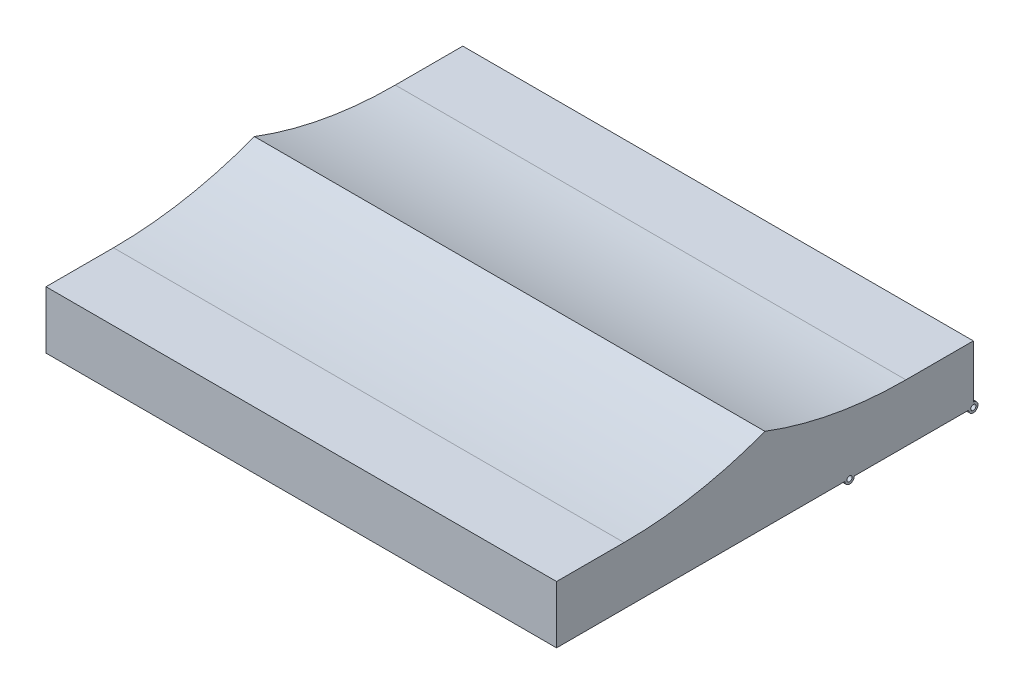
ISO-10303-21;
HEADER;
FILE_DESCRIPTION(('STEP AP214'),'2;1');
FILE_NAME('part.step','',(''),(''),'','','');
FILE_SCHEMA(('AUTOMOTIVE_DESIGN { 1 0 10303 214 1 1 1 1 }'));
ENDSEC;
DATA;
#1=APPLICATION_CONTEXT('core data for automotive mechanical design processes');
#2=APPLICATION_PROTOCOL_DEFINITION('international standard','automotive_design',2000,#1);
#3=PRODUCT_CONTEXT('',#1,'mechanical');
#4=PRODUCT('Part','Part','',(#3));
#5=PRODUCT_RELATED_PRODUCT_CATEGORY('part','',(#4));
#6=PRODUCT_DEFINITION_FORMATION('','',#4);
#7=PRODUCT_DEFINITION_CONTEXT('part definition',#1,'design');
#8=PRODUCT_DEFINITION('design','',#6,#7);
#9=PRODUCT_DEFINITION_SHAPE('','',#8);
#10=(LENGTH_UNIT() NAMED_UNIT(*) SI_UNIT(.MILLI.,.METRE.));
#11=(NAMED_UNIT(*) PLANE_ANGLE_UNIT() SI_UNIT($,.RADIAN.));
#12=(NAMED_UNIT(*) SI_UNIT($,.STERADIAN.) SOLID_ANGLE_UNIT());
#13=UNCERTAINTY_MEASURE_WITH_UNIT(LENGTH_MEASURE(1.E-05),#10,'distance_accuracy_value','');
#14=(GEOMETRIC_REPRESENTATION_CONTEXT(3) GLOBAL_UNCERTAINTY_ASSIGNED_CONTEXT((#13)) GLOBAL_UNIT_ASSIGNED_CONTEXT((#10,
#11,#12)) REPRESENTATION_CONTEXT('',''));
#15=CARTESIAN_POINT('',(0.,0.,0.));
#16=DIRECTION('',(0.,0.,1.));
#17=DIRECTION('',(1.,0.,0.));
#18=AXIS2_PLACEMENT_3D('',#15,#16,#17);
#19=CARTESIAN_POINT('',(245.,-19.3460402114396,-81.23));
#20=DIRECTION('',(1.,0.,0.));
#21=DIRECTION('',(0.,0.,-1.));
#22=AXIS2_PLACEMENT_3D('',#19,#20,#21);
#23=PLANE('',#22);
#24=CARTESIAN_POINT('',(245.,-19.5001634742624,-200.));
#25=DIRECTION('',(1.,0.,0.));
#26=DIRECTION('',(0.,0.,-1.));
#27=AXIS2_PLACEMENT_3D('',#24,#25,#26);
#28=CIRCLE('',#27,2.5);
#29=CARTESIAN_POINT('',(245.,-19.5001634742624,-202.5));
#30=VERTEX_POINT('',#29);
#31=EDGE_CURVE('E170',#30,#30,#28,.T.);
#32=ORIENTED_EDGE('',*,*,#31,.F.);
#33=EDGE_LOOP('',(#32));
#34=FACE_BOUND('',#33,.T.);
#35=DIRECTION('',(0.,0.,-1.));
#36=VECTOR('',#35,1.);
#37=CARTESIAN_POINT('',(245.,-19.3460402114396,200.));
#38=LINE('',#37,#36);
#39=CARTESIAN_POINT('',(245.,-19.3460402114396,200.));
#40=VERTEX_POINT('',#39);
#41=CARTESIAN_POINT('',(245.,-19.3460402114396,-76.73));
#42=VERTEX_POINT('',#41);
#43=EDGE_CURVE('E197',#40,#42,#38,.T.);
#44=ORIENTED_EDGE('',*,*,#43,.T.);
#45=CARTESIAN_POINT('',(245.,-19.3460402114396,-81.23));
#46=DIRECTION('',(1.,0.,0.));
#47=DIRECTION('',(0.,0.,-1.));
#48=AXIS2_PLACEMENT_3D('',#45,#46,#47);
#49=CIRCLE('',#48,4.5);
#50=CARTESIAN_POINT('',(245.,-19.3548194629897,-85.7299914360743));
#51=VERTEX_POINT('',#50);
#52=EDGE_CURVE('E115',#42,#51,#49,.T.);
#53=ORIENTED_EDGE('',*,*,#52,.T.);
#54=DIRECTION('',(0.,-0.00144233146940823,-0.999998959839425));
#55=VECTOR('',#54,1.);
#56=CARTESIAN_POINT('',(245.,-19.3548194629897,-85.7299914360743));
#57=LINE('',#56,#55);
#58=CARTESIAN_POINT('',(245.,-19.5001634742624,-186.500073192128));
#59=VERTEX_POINT('',#58);
#60=EDGE_CURVE('E230',#51,#59,#57,.T.);
#61=ORIENTED_EDGE('',*,*,#60,.T.);
#62=DIRECTION('',(0.,0.,-1.));
#63=VECTOR('',#62,1.);
#64=CARTESIAN_POINT('',(245.,-19.5001634742624,-186.500073192128));
#65=LINE('',#64,#63);
#66=CARTESIAN_POINT('',(245.,-19.5001634742624,-195.524048894466));
#67=VERTEX_POINT('',#66);
#68=EDGE_CURVE('E250',#59,#67,#65,.T.);
#69=ORIENTED_EDGE('',*,*,#68,.T.);
#70=CARTESIAN_POINT('',(245.,-19.5001634742624,-200.));
#71=DIRECTION('',(1.,0.,0.));
#72=DIRECTION('',(0.,0.,-1.));
#73=AXIS2_PLACEMENT_3D('',#70,#71,#72);
#74=CIRCLE('',#73,4.47595110553423);
#75=CARTESIAN_POINT('',(245.,-15.0242123687281,-200.));
#76=VERTEX_POINT('',#75);
#77=EDGE_CURVE('E246',#67,#76,#74,.T.);
#78=ORIENTED_EDGE('',*,*,#77,.T.);
#79=DIRECTION('',(0.,1.,0.));
#80=VECTOR('',#79,1.);
#81=CARTESIAN_POINT('',(245.,-15.0242123687281,-200.));
#82=LINE('',#81,#80);
#83=CARTESIAN_POINT('',(245.,35.8357876312719,-200.));
#84=VERTEX_POINT('',#83);
#85=EDGE_CURVE('E249',#76,#84,#82,.T.);
#86=ORIENTED_EDGE('',*,*,#85,.T.);
#87=DIRECTION('',(0.,0.,1.));
#88=VECTOR('',#87,1.);
#89=CARTESIAN_POINT('',(245.,35.8357876312719,-200.));
#90=LINE('',#89,#88);
#91=CARTESIAN_POINT('',(245.,35.8357876312718,-135.24));
#92=VERTEX_POINT('',#91);
#93=EDGE_CURVE('E254',#84,#92,#90,.T.);
#94=ORIENTED_EDGE('',*,*,#93,.T.);
#95=CARTESIAN_POINT('',(245.,416.55239053099,-135.24));
#96=DIRECTION('',(-1.,0.,0.));
#97=DIRECTION('',(0.,0.,1.));
#98=AXIS2_PLACEMENT_3D('',#95,#96,#97);
#99=CIRCLE('',#98,380.716602899719);
#100=CARTESIAN_POINT('',(245.,60.6657876312717,1.66533453693773E-13));
#101=VERTEX_POINT('',#100);
#102=EDGE_CURVE('E143',#92,#101,#99,.T.);
#103=ORIENTED_EDGE('',*,*,#102,.T.);
#104=CARTESIAN_POINT('',(245.,416.55239053099,135.24));
#105=DIRECTION('',(-1.,0.,0.));
#106=DIRECTION('',(0.,0.,-1.));
#107=AXIS2_PLACEMENT_3D('',#104,#105,#106);
#108=CIRCLE('',#107,380.716602899719);
#109=CARTESIAN_POINT('',(245.,35.8357876312719,135.24));
#110=VERTEX_POINT('',#109);
#111=EDGE_CURVE('E137',#101,#110,#108,.T.);
#112=ORIENTED_EDGE('',*,*,#111,.T.);
#113=DIRECTION('',(0.,0.,1.));
#114=VECTOR('',#113,1.);
#115=CARTESIAN_POINT('',(245.,35.8357876312719,200.));
#116=LINE('',#115,#114);
#117=CARTESIAN_POINT('',(245.,35.8357876312719,200.));
#118=VERTEX_POINT('',#117);
#119=EDGE_CURVE('E141',#110,#118,#116,.T.);
#120=ORIENTED_EDGE('',*,*,#119,.T.);
#121=DIRECTION('',(0.,-1.,0.));
#122=VECTOR('',#121,1.);
#123=CARTESIAN_POINT('',(245.,-19.3460402114396,200.));
#124=LINE('',#123,#122);
#125=EDGE_CURVE('E63',#118,#40,#124,.T.);
#126=ORIENTED_EDGE('',*,*,#125,.T.);
#127=EDGE_LOOP('',(#44,#53,#61,#69,#78,#86,#94,#103,#112,#120,#126));
#128=FACE_BOUND('',#127,.T.);
#129=CARTESIAN_POINT('',(245.,-19.3460402114396,-81.23));
#130=DIRECTION('',(1.,0.,0.));
#131=DIRECTION('',(0.,0.,-1.));
#132=AXIS2_PLACEMENT_3D('',#129,#130,#131);
#133=CIRCLE('',#132,2.50000000000001);
#134=CARTESIAN_POINT('',(245.,-19.3460402114396,-83.73));
#135=VERTEX_POINT('',#134);
#136=EDGE_CURVE('E301',#135,#135,#133,.T.);
#137=ORIENTED_EDGE('',*,*,#136,.F.);
#138=EDGE_LOOP('',(#137));
#139=FACE_BOUND('',#138,.T.);
#140=ADVANCED_FACE('F45',(#34,#128,#139),#23,.T.);
#141=CARTESIAN_POINT('',(-245.,-19.3460402114396,-81.23));
#142=DIRECTION('',(1.,0.,0.));
#143=DIRECTION('',(0.,0.,-1.));
#144=AXIS2_PLACEMENT_3D('',#141,#142,#143);
#145=PLANE('',#144);
#146=DIRECTION('',(0.,0.,-1.));
#147=VECTOR('',#146,1.);
#148=CARTESIAN_POINT('',(-245.,-19.3460402114396,200.));
#149=LINE('',#148,#147);
#150=CARTESIAN_POINT('',(-245.,-19.3460402114396,200.));
#151=VERTEX_POINT('',#150);
#152=CARTESIAN_POINT('',(-245.,-19.3460402114396,-76.73));
#153=VERTEX_POINT('',#152);
#154=EDGE_CURVE('E165',#151,#153,#149,.T.);
#155=ORIENTED_EDGE('',*,*,#154,.F.);
#156=DIRECTION('',(0.,-1.,0.));
#157=VECTOR('',#156,1.);
#158=CARTESIAN_POINT('',(-245.,-19.3460402114396,200.));
#159=LINE('',#158,#157);
#160=CARTESIAN_POINT('',(-245.,35.8357876312719,200.));
#161=VERTEX_POINT('',#160);
#162=EDGE_CURVE('E107',#161,#151,#159,.T.);
#163=ORIENTED_EDGE('',*,*,#162,.F.);
#164=DIRECTION('',(0.,0.,1.));
#165=VECTOR('',#164,1.);
#166=CARTESIAN_POINT('',(-245.,35.8357876312719,200.));
#167=LINE('',#166,#165);
#168=CARTESIAN_POINT('',(-245.,35.8357876312719,135.24));
#169=VERTEX_POINT('',#168);
#170=EDGE_CURVE('E101',#169,#161,#167,.T.);
#171=ORIENTED_EDGE('',*,*,#170,.F.);
#172=CARTESIAN_POINT('',(-245.,416.55239053099,135.24));
#173=DIRECTION('',(-1.,0.,0.));
#174=DIRECTION('',(0.,0.,-1.));
#175=AXIS2_PLACEMENT_3D('',#172,#173,#174);
#176=CIRCLE('',#175,380.716602899719);
#177=CARTESIAN_POINT('',(-245.,60.6657876312717,1.66533453693773E-13));
#178=VERTEX_POINT('',#177);
#179=EDGE_CURVE('E152',#178,#169,#176,.T.);
#180=ORIENTED_EDGE('',*,*,#179,.F.);
#181=CARTESIAN_POINT('',(-245.,416.55239053099,-135.24));
#182=DIRECTION('',(-1.,0.,0.));
#183=DIRECTION('',(0.,0.,1.));
#184=AXIS2_PLACEMENT_3D('',#181,#182,#183);
#185=CIRCLE('',#184,380.716602899719);
#186=CARTESIAN_POINT('',(-245.,35.8357876312718,-135.24));
#187=VERTEX_POINT('',#186);
#188=EDGE_CURVE('E188',#187,#178,#185,.T.);
#189=ORIENTED_EDGE('',*,*,#188,.F.);
#190=DIRECTION('',(0.,0.,1.));
#191=VECTOR('',#190,1.);
#192=CARTESIAN_POINT('',(-245.,35.8357876312719,-200.));
#193=LINE('',#192,#191);
#194=CARTESIAN_POINT('',(-245.,35.8357876312719,-200.));
#195=VERTEX_POINT('',#194);
#196=EDGE_CURVE('E185',#195,#187,#193,.T.);
#197=ORIENTED_EDGE('',*,*,#196,.F.);
#198=DIRECTION('',(0.,1.,0.));
#199=VECTOR('',#198,1.);
#200=CARTESIAN_POINT('',(-245.,-15.0242123687281,-200.));
#201=LINE('',#200,#199);
#202=CARTESIAN_POINT('',(-245.,-15.0242123687281,-200.));
#203=VERTEX_POINT('',#202);
#204=EDGE_CURVE('E182',#203,#195,#201,.T.);
#205=ORIENTED_EDGE('',*,*,#204,.F.);
#206=CARTESIAN_POINT('',(-245.,-19.5001634742624,-200.));
#207=DIRECTION('',(1.,0.,0.));
#208=DIRECTION('',(0.,0.,-1.));
#209=AXIS2_PLACEMENT_3D('',#206,#207,#208);
#210=CIRCLE('',#209,4.47595110553423);
#211=CARTESIAN_POINT('',(-245.,-19.5001634742624,-195.524048894466));
#212=VERTEX_POINT('',#211);
#213=EDGE_CURVE('E179',#212,#203,#210,.T.);
#214=ORIENTED_EDGE('',*,*,#213,.F.);
#215=DIRECTION('',(0.,0.,-1.));
#216=VECTOR('',#215,1.);
#217=CARTESIAN_POINT('',(-245.,-19.5001634742624,-186.500073192128));
#218=LINE('',#217,#216);
#219=CARTESIAN_POINT('',(-245.,-19.5001634742624,-186.500073192128));
#220=VERTEX_POINT('',#219);
#221=EDGE_CURVE('E176',#220,#212,#218,.T.);
#222=ORIENTED_EDGE('',*,*,#221,.F.);
#223=DIRECTION('',(0.,-0.00144233146940823,-0.999998959839425));
#224=VECTOR('',#223,1.);
#225=CARTESIAN_POINT('',(-245.,-19.3548194629897,-85.7299914360743));
#226=LINE('',#225,#224);
#227=CARTESIAN_POINT('',(-245.,-19.3548194629897,-85.7299914360743));
#228=VERTEX_POINT('',#227);
#229=EDGE_CURVE('E173',#228,#220,#226,.T.);
#230=ORIENTED_EDGE('',*,*,#229,.F.);
#231=CARTESIAN_POINT('',(-245.,-19.3460402114396,-81.23));
#232=DIRECTION('',(1.,0.,0.));
#233=DIRECTION('',(0.,0.,-1.));
#234=AXIS2_PLACEMENT_3D('',#231,#232,#233);
#235=CIRCLE('',#234,4.5);
#236=EDGE_CURVE('E169',#153,#228,#235,.T.);
#237=ORIENTED_EDGE('',*,*,#236,.F.);
#238=EDGE_LOOP('',(#155,#163,#171,#180,#189,#197,#205,#214,#222,#230,#237));
#239=FACE_BOUND('',#238,.T.);
#240=CARTESIAN_POINT('',(-245.,-19.5001634742624,-200.));
#241=DIRECTION('',(1.,0.,0.));
#242=DIRECTION('',(0.,0.,-1.));
#243=AXIS2_PLACEMENT_3D('',#240,#241,#242);
#244=CIRCLE('',#243,2.5);
#245=CARTESIAN_POINT('',(-245.,-19.5001634742624,-202.5));
#246=VERTEX_POINT('',#245);
#247=EDGE_CURVE('E309',#246,#246,#244,.T.);
#248=ORIENTED_EDGE('',*,*,#247,.T.);
#249=EDGE_LOOP('',(#248));
#250=FACE_BOUND('',#249,.T.);
#251=CARTESIAN_POINT('',(-245.,-19.3460402114396,-81.23));
#252=DIRECTION('',(1.,0.,0.));
#253=DIRECTION('',(0.,0.,-1.));
#254=AXIS2_PLACEMENT_3D('',#251,#252,#253);
#255=CIRCLE('',#254,2.50000000000001);
#256=CARTESIAN_POINT('',(-245.,-19.3460402114396,-83.73));
#257=VERTEX_POINT('',#256);
#258=EDGE_CURVE('E304',#257,#257,#255,.T.);
#259=ORIENTED_EDGE('',*,*,#258,.T.);
#260=EDGE_LOOP('',(#259));
#261=FACE_BOUND('',#260,.T.);
#262=ADVANCED_FACE('F234',(#239,#250,#261),#145,.F.);
#263=CARTESIAN_POINT('',(245.,-19.3460402114396,200.));
#264=DIRECTION('',(0.,1.,0.));
#265=DIRECTION('',(0.,0.,1.));
#266=AXIS2_PLACEMENT_3D('',#263,#264,#265);
#267=PLANE('',#266);
#268=ORIENTED_EDGE('',*,*,#154,.T.);
#269=DIRECTION('',(-1.,0.,0.));
#270=VECTOR('',#269,1.);
#271=CARTESIAN_POINT('',(245.,-19.3460402114396,-76.73));
#272=LINE('',#271,#270);
#273=EDGE_CURVE('E11',#42,#153,#272,.T.);
#274=ORIENTED_EDGE('',*,*,#273,.F.);
#275=ORIENTED_EDGE('',*,*,#43,.F.);
#276=DIRECTION('',(-1.,0.,0.));
#277=VECTOR('',#276,1.);
#278=CARTESIAN_POINT('',(245.,-19.3460402114396,200.));
#279=LINE('',#278,#277);
#280=EDGE_CURVE('E161',#40,#151,#279,.T.);
#281=ORIENTED_EDGE('',*,*,#280,.T.);
#282=EDGE_LOOP('',(#268,#274,#275,#281));
#283=FACE_BOUND('',#282,.T.);
#284=ADVANCED_FACE('F47',(#283),#267,.F.);
#285=CARTESIAN_POINT('',(245.,-19.3460402114396,-81.23));
#286=DIRECTION('',(-1.,0.,0.));
#287=DIRECTION('',(0.,0.,1.));
#288=AXIS2_PLACEMENT_3D('',#285,#286,#287);
#289=CYLINDRICAL_SURFACE('',#288,4.5);
#290=ORIENTED_EDGE('',*,*,#236,.T.);
#291=DIRECTION('',(-1.,0.,0.));
#292=VECTOR('',#291,1.);
#293=CARTESIAN_POINT('',(245.,-19.3548194629897,-85.7299914360743));
#294=LINE('',#293,#292);
#295=EDGE_CURVE('E55',#51,#228,#294,.T.);
#296=ORIENTED_EDGE('',*,*,#295,.F.);
#297=ORIENTED_EDGE('',*,*,#52,.F.);
#298=ORIENTED_EDGE('',*,*,#273,.T.);
#299=EDGE_LOOP('',(#290,#296,#297,#298));
#300=FACE_BOUND('',#299,.T.);
#301=ADVANCED_FACE('F406',(#300),#289,.T.);
#302=CARTESIAN_POINT('',(245.,-19.3548194629897,-85.7299914360743));
#303=DIRECTION('',(0.,0.999998959839425,-0.00144233146940823));
#304=DIRECTION('',(0.,0.00144233146940823,0.999998959839425));
#305=AXIS2_PLACEMENT_3D('',#302,#303,#304);
#306=PLANE('',#305);
#307=ORIENTED_EDGE('',*,*,#229,.T.);
#308=DIRECTION('',(-1.,0.,0.));
#309=VECTOR('',#308,1.);
#310=CARTESIAN_POINT('',(245.,-19.5001634742624,-186.500073192128));
#311=LINE('',#310,#309);
#312=EDGE_CURVE('E220',#59,#220,#311,.T.);
#313=ORIENTED_EDGE('',*,*,#312,.F.);
#314=ORIENTED_EDGE('',*,*,#60,.F.);
#315=ORIENTED_EDGE('',*,*,#295,.T.);
#316=EDGE_LOOP('',(#307,#313,#314,#315));
#317=FACE_BOUND('',#316,.T.);
#318=ADVANCED_FACE('F228',(#317),#306,.F.);
#319=CARTESIAN_POINT('',(245.,-19.5001634742624,-186.500073192128));
#320=DIRECTION('',(0.,1.,0.));
#321=DIRECTION('',(0.,0.,1.));
#322=AXIS2_PLACEMENT_3D('',#319,#320,#321);
#323=PLANE('',#322);
#324=ORIENTED_EDGE('',*,*,#221,.T.);
#325=DIRECTION('',(-1.,0.,0.));
#326=VECTOR('',#325,1.);
#327=CARTESIAN_POINT('',(245.,-19.5001634742624,-195.524048894466));
#328=LINE('',#327,#326);
#329=EDGE_CURVE('E216',#67,#212,#328,.T.);
#330=ORIENTED_EDGE('',*,*,#329,.F.);
#331=ORIENTED_EDGE('',*,*,#68,.F.);
#332=ORIENTED_EDGE('',*,*,#312,.T.);
#333=EDGE_LOOP('',(#324,#330,#331,#332));
#334=FACE_BOUND('',#333,.T.);
#335=ADVANCED_FACE('F240',(#334),#323,.F.);
#336=CARTESIAN_POINT('',(245.,-19.5001634742624,-200.));
#337=DIRECTION('',(-1.,0.,0.));
#338=DIRECTION('',(0.,0.,1.));
#339=AXIS2_PLACEMENT_3D('',#336,#337,#338);
#340=CYLINDRICAL_SURFACE('',#339,4.47595110553423);
#341=ORIENTED_EDGE('',*,*,#213,.T.);
#342=DIRECTION('',(-1.,0.,0.));
#343=VECTOR('',#342,1.);
#344=CARTESIAN_POINT('',(245.,-15.0242123687281,-200.));
#345=LINE('',#344,#343);
#346=EDGE_CURVE('E212',#76,#203,#345,.T.);
#347=ORIENTED_EDGE('',*,*,#346,.F.);
#348=ORIENTED_EDGE('',*,*,#77,.F.);
#349=ORIENTED_EDGE('',*,*,#329,.T.);
#350=EDGE_LOOP('',(#341,#347,#348,#349));
#351=FACE_BOUND('',#350,.T.);
#352=ADVANCED_FACE('F244',(#351),#340,.T.);
#353=CARTESIAN_POINT('',(245.,-15.0242123687281,-200.));
#354=DIRECTION('',(0.,0.,1.));
#355=DIRECTION('',(1.,0.,0.));
#356=AXIS2_PLACEMENT_3D('',#353,#354,#355);
#357=PLANE('',#356);
#358=ORIENTED_EDGE('',*,*,#204,.T.);
#359=DIRECTION('',(-1.,0.,0.));
#360=VECTOR('',#359,1.);
#361=CARTESIAN_POINT('',(245.,35.8357876312719,-200.));
#362=LINE('',#361,#360);
#363=EDGE_CURVE('E208',#84,#195,#362,.T.);
#364=ORIENTED_EDGE('',*,*,#363,.F.);
#365=ORIENTED_EDGE('',*,*,#85,.F.);
#366=ORIENTED_EDGE('',*,*,#346,.T.);
#367=EDGE_LOOP('',(#358,#364,#365,#366));
#368=FACE_BOUND('',#367,.T.);
#369=ADVANCED_FACE('F368',(#368),#357,.F.);
#370=CARTESIAN_POINT('',(245.,35.8357876312719,-200.));
#371=DIRECTION('',(0.,-1.,0.));
#372=DIRECTION('',(0.,0.,-1.));
#373=AXIS2_PLACEMENT_3D('',#370,#371,#372);
#374=PLANE('',#373);
#375=ORIENTED_EDGE('',*,*,#196,.T.);
#376=DIRECTION('',(-1.,0.,0.));
#377=VECTOR('',#376,1.);
#378=CARTESIAN_POINT('',(245.,35.8357876312718,-135.24));
#379=LINE('',#378,#377);
#380=EDGE_CURVE('E204',#92,#187,#379,.T.);
#381=ORIENTED_EDGE('',*,*,#380,.F.);
#382=ORIENTED_EDGE('',*,*,#93,.F.);
#383=ORIENTED_EDGE('',*,*,#363,.T.);
#384=EDGE_LOOP('',(#375,#381,#382,#383));
#385=FACE_BOUND('',#384,.T.);
#386=ADVANCED_FACE('F265',(#385),#374,.F.);
#387=CARTESIAN_POINT('',(245.,416.55239053099,-135.24));
#388=DIRECTION('',(-1.,0.,0.));
#389=DIRECTION('',(0.,0.,1.));
#390=AXIS2_PLACEMENT_3D('',#387,#388,#389);
#391=CYLINDRICAL_SURFACE('',#390,380.716602899719);
#392=ORIENTED_EDGE('',*,*,#188,.T.);
#393=DIRECTION('',(-1.,0.,0.));
#394=VECTOR('',#393,1.);
#395=CARTESIAN_POINT('',(245.,60.6657876312717,1.66533453693773E-13));
#396=LINE('',#395,#394);
#397=EDGE_CURVE('E154',#101,#178,#396,.T.);
#398=ORIENTED_EDGE('',*,*,#397,.F.);
#399=ORIENTED_EDGE('',*,*,#102,.F.);
#400=ORIENTED_EDGE('',*,*,#380,.T.);
#401=EDGE_LOOP('',(#392,#398,#399,#400));
#402=FACE_BOUND('',#401,.T.);
#403=ADVANCED_FACE('F269',(#402),#391,.F.);
#404=CARTESIAN_POINT('',(245.,416.55239053099,135.24));
#405=DIRECTION('',(-1.,0.,0.));
#406=DIRECTION('',(0.,0.,1.));
#407=AXIS2_PLACEMENT_3D('',#404,#405,#406);
#408=CYLINDRICAL_SURFACE('',#407,380.716602899719);
#409=ORIENTED_EDGE('',*,*,#179,.T.);
#410=DIRECTION('',(-1.,0.,0.));
#411=VECTOR('',#410,1.);
#412=CARTESIAN_POINT('',(245.,35.8357876312719,135.24));
#413=LINE('',#412,#411);
#414=EDGE_CURVE('E149',#110,#169,#413,.T.);
#415=ORIENTED_EDGE('',*,*,#414,.F.);
#416=ORIENTED_EDGE('',*,*,#111,.F.);
#417=ORIENTED_EDGE('',*,*,#397,.T.);
#418=EDGE_LOOP('',(#409,#415,#416,#417));
#419=FACE_BOUND('',#418,.T.);
#420=ADVANCED_FACE('F150',(#419),#408,.F.);
#421=CARTESIAN_POINT('',(245.,35.8357876312719,200.));
#422=DIRECTION('',(0.,-1.,0.));
#423=DIRECTION('',(0.,0.,-1.));
#424=AXIS2_PLACEMENT_3D('',#421,#422,#423);
#425=PLANE('',#424);
#426=ORIENTED_EDGE('',*,*,#170,.T.);
#427=DIRECTION('',(-1.,0.,0.));
#428=VECTOR('',#427,1.);
#429=CARTESIAN_POINT('',(245.,35.8357876312719,200.));
#430=LINE('',#429,#428);
#431=EDGE_CURVE('E155',#118,#161,#430,.T.);
#432=ORIENTED_EDGE('',*,*,#431,.F.);
#433=ORIENTED_EDGE('',*,*,#119,.F.);
#434=ORIENTED_EDGE('',*,*,#414,.T.);
#435=EDGE_LOOP('',(#426,#432,#433,#434));
#436=FACE_BOUND('',#435,.T.);
#437=ADVANCED_FACE('F157',(#436),#425,.F.);
#438=CARTESIAN_POINT('',(245.,-19.3460402114396,200.));
#439=DIRECTION('',(0.,0.,-1.));
#440=DIRECTION('',(-1.,0.,0.));
#441=AXIS2_PLACEMENT_3D('',#438,#439,#440);
#442=PLANE('',#441);
#443=ORIENTED_EDGE('',*,*,#162,.T.);
#444=ORIENTED_EDGE('',*,*,#280,.F.);
#445=ORIENTED_EDGE('',*,*,#125,.F.);
#446=ORIENTED_EDGE('',*,*,#431,.T.);
#447=EDGE_LOOP('',(#443,#444,#445,#446));
#448=FACE_BOUND('',#447,.T.);
#449=ADVANCED_FACE('F273',(#448),#442,.F.);
#450=CARTESIAN_POINT('',(245.,-19.5001634742624,-200.));
#451=DIRECTION('',(-1.,0.,0.));
#452=DIRECTION('',(0.,0.,1.));
#453=AXIS2_PLACEMENT_3D('',#450,#451,#452);
#454=CYLINDRICAL_SURFACE('',#453,2.5);
#455=ORIENTED_EDGE('',*,*,#31,.T.);
#456=EDGE_LOOP('',(#455));
#457=FACE_BOUND('',#456,.T.);
#458=ORIENTED_EDGE('',*,*,#247,.F.);
#459=EDGE_LOOP('',(#458));
#460=FACE_BOUND('',#459,.T.);
#461=ADVANCED_FACE('F275',(#457,#460),#454,.F.);
#462=CARTESIAN_POINT('',(245.,-19.3460402114396,-81.23));
#463=DIRECTION('',(-1.,0.,0.));
#464=DIRECTION('',(0.,0.,1.));
#465=AXIS2_PLACEMENT_3D('',#462,#463,#464);
#466=CYLINDRICAL_SURFACE('',#465,2.50000000000001);
#467=ORIENTED_EDGE('',*,*,#136,.T.);
#468=EDGE_LOOP('',(#467));
#469=FACE_BOUND('',#468,.T.);
#470=ORIENTED_EDGE('',*,*,#258,.F.);
#471=EDGE_LOOP('',(#470));
#472=FACE_BOUND('',#471,.T.);
#473=ADVANCED_FACE('F281',(#469,#472),#466,.F.);
#474=CLOSED_SHELL('',(#140,#262,#284,#301,#318,#335,#352,#369,#386,#403,#420,#437,#449,#461,#473));
#475=MANIFOLD_SOLID_BREP('B2',#474);
#476=ADVANCED_BREP_SHAPE_REPRESENTATION('',(#18,#475),#14);
#477=SHAPE_DEFINITION_REPRESENTATION(#9,#476);
ENDSEC;
END-ISO-10303-21;
